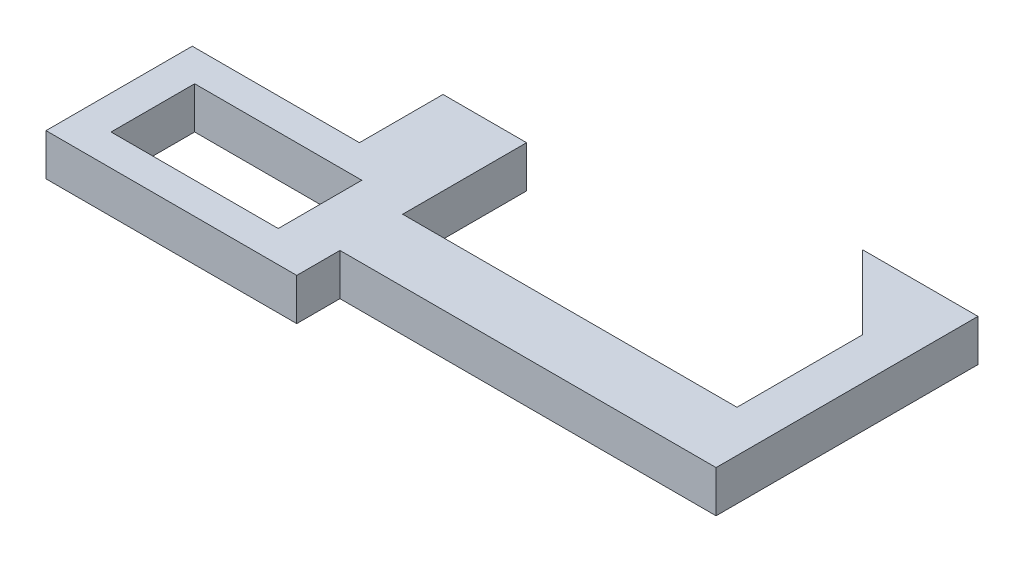
ISO-10303-21;
HEADER;
FILE_DESCRIPTION(('STEP AP214'),'2;1');
FILE_NAME('part.step','',(''),(''),'','','');
FILE_SCHEMA(('AUTOMOTIVE_DESIGN { 1 0 10303 214 1 1 1 1 }'));
ENDSEC;
DATA;
#1=APPLICATION_CONTEXT('core data for automotive mechanical design processes');
#2=APPLICATION_PROTOCOL_DEFINITION('international standard','automotive_design',2000,#1);
#3=PRODUCT_CONTEXT('',#1,'mechanical');
#4=PRODUCT('Part','Part','',(#3));
#5=PRODUCT_RELATED_PRODUCT_CATEGORY('part','',(#4));
#6=PRODUCT_DEFINITION_FORMATION('','',#4);
#7=PRODUCT_DEFINITION_CONTEXT('part definition',#1,'design');
#8=PRODUCT_DEFINITION('design','',#6,#7);
#9=PRODUCT_DEFINITION_SHAPE('','',#8);
#10=(LENGTH_UNIT() NAMED_UNIT(*) SI_UNIT(.MILLI.,.METRE.));
#11=(NAMED_UNIT(*) PLANE_ANGLE_UNIT() SI_UNIT($,.RADIAN.));
#12=(NAMED_UNIT(*) SI_UNIT($,.STERADIAN.) SOLID_ANGLE_UNIT());
#13=UNCERTAINTY_MEASURE_WITH_UNIT(LENGTH_MEASURE(1.E-05),#10,'distance_accuracy_value','');
#14=(GEOMETRIC_REPRESENTATION_CONTEXT(3) GLOBAL_UNCERTAINTY_ASSIGNED_CONTEXT((#13)) GLOBAL_UNIT_ASSIGNED_CONTEXT((#10,
#11,#12)) REPRESENTATION_CONTEXT('',''));
#15=CARTESIAN_POINT('',(0.,0.,0.));
#16=DIRECTION('',(0.,0.,1.));
#17=DIRECTION('',(1.,0.,0.));
#18=AXIS2_PLACEMENT_3D('',#15,#16,#17);
#19=CARTESIAN_POINT('',(0.,0.5,-22.7988803677588));
#20=DIRECTION('',(0.,0.,1.));
#21=DIRECTION('',(1.,0.,0.));
#22=AXIS2_PLACEMENT_3D('',#19,#20,#21);
#23=PLANE('',#22);
#24=DIRECTION('',(-1.,0.,0.));
#25=VECTOR('',#24,1.);
#26=CARTESIAN_POINT('',(0.,0.,-22.7988803677588));
#27=LINE('',#26,#25);
#28=CARTESIAN_POINT('',(-28.9731789791487,0.,-22.7988803677588));
#29=VERTEX_POINT('',#28);
#30=CARTESIAN_POINT('',(-30.9732967707679,0.,-22.7988803677588));
#31=VERTEX_POINT('',#30);
#32=EDGE_CURVE('E269',#29,#31,#27,.T.);
#33=ORIENTED_EDGE('',*,*,#32,.T.);
#34=DIRECTION('',(0.,-1.,0.));
#35=VECTOR('',#34,1.);
#36=CARTESIAN_POINT('',(-30.9732967707679,0.5,-22.7988803677588));
#37=LINE('',#36,#35);
#38=CARTESIAN_POINT('',(-30.9732967707679,0.5,-22.7988803677588));
#39=VERTEX_POINT('',#38);
#40=EDGE_CURVE('E11',#39,#31,#37,.T.);
#41=ORIENTED_EDGE('',*,*,#40,.F.);
#42=DIRECTION('',(-1.,0.,0.));
#43=VECTOR('',#42,1.);
#44=CARTESIAN_POINT('',(0.,0.5,-22.7988803677588));
#45=LINE('',#44,#43);
#46=CARTESIAN_POINT('',(-28.9731789791487,0.5,-22.7988803677588));
#47=VERTEX_POINT('',#46);
#48=EDGE_CURVE('E203',#47,#39,#45,.T.);
#49=ORIENTED_EDGE('',*,*,#48,.F.);
#50=DIRECTION('',(0.,-1.,0.));
#51=VECTOR('',#50,1.);
#52=CARTESIAN_POINT('',(-28.9731789791487,0.5,-22.7988803677588));
#53=LINE('',#52,#51);
#54=EDGE_CURVE('E221',#47,#29,#53,.T.);
#55=ORIENTED_EDGE('',*,*,#54,.T.);
#56=EDGE_LOOP('',(#33,#41,#49,#55));
#57=FACE_BOUND('',#56,.T.);
#58=ADVANCED_FACE('F39',(#57),#23,.F.);
#59=CARTESIAN_POINT('',(-30.9732967707679,0.5,0.));
#60=DIRECTION('',(-1.,0.,0.));
#61=DIRECTION('',(0.,0.,1.));
#62=AXIS2_PLACEMENT_3D('',#59,#60,#61);
#63=PLANE('',#62);
#64=DIRECTION('',(0.,0.,-1.));
#65=VECTOR('',#64,1.);
#66=CARTESIAN_POINT('',(-30.9732967707679,0.,0.));
#67=LINE('',#66,#65);
#68=CARTESIAN_POINT('',(-30.9732967707679,0.,-21.0488803677588));
#69=VERTEX_POINT('',#68);
#70=EDGE_CURVE('E272',#69,#31,#67,.T.);
#71=ORIENTED_EDGE('',*,*,#70,.F.);
#72=DIRECTION('',(0.,-1.,0.));
#73=VECTOR('',#72,1.);
#74=CARTESIAN_POINT('',(-30.9732967707679,0.5,-21.0488803677588));
#75=LINE('',#74,#73);
#76=CARTESIAN_POINT('',(-30.9732967707679,0.5,-21.0488803677588));
#77=VERTEX_POINT('',#76);
#78=EDGE_CURVE('E49',#77,#69,#75,.T.);
#79=ORIENTED_EDGE('',*,*,#78,.F.);
#80=DIRECTION('',(0.,0.,-1.));
#81=VECTOR('',#80,1.);
#82=CARTESIAN_POINT('',(-30.9732967707679,0.5,0.));
#83=LINE('',#82,#81);
#84=EDGE_CURVE('E199',#77,#39,#83,.T.);
#85=ORIENTED_EDGE('',*,*,#84,.T.);
#86=ORIENTED_EDGE('',*,*,#40,.T.);
#87=EDGE_LOOP('',(#71,#79,#85,#86));
#88=FACE_BOUND('',#87,.T.);
#89=ADVANCED_FACE('F319',(#88),#63,.T.);
#90=CARTESIAN_POINT('',(0.,0.5,-21.0488803677588));
#91=DIRECTION('',(0.,0.,1.));
#92=DIRECTION('',(1.,0.,0.));
#93=AXIS2_PLACEMENT_3D('',#90,#91,#92);
#94=PLANE('',#93);
#95=DIRECTION('',(-1.,0.,0.));
#96=VECTOR('',#95,1.);
#97=CARTESIAN_POINT('',(0.,0.,-21.0488803677588));
#98=LINE('',#97,#96);
#99=CARTESIAN_POINT('',(-27.9732967707679,0.,-21.0488803677588));
#100=VERTEX_POINT('',#99);
#101=EDGE_CURVE('E275',#100,#69,#98,.T.);
#102=ORIENTED_EDGE('',*,*,#101,.F.);
#103=DIRECTION('',(0.,-1.,0.));
#104=VECTOR('',#103,1.);
#105=CARTESIAN_POINT('',(-27.9732967707679,0.5,-21.0488803677588));
#106=LINE('',#105,#104);
#107=CARTESIAN_POINT('',(-27.9732967707679,0.5,-21.0488803677588));
#108=VERTEX_POINT('',#107);
#109=EDGE_CURVE('E237',#108,#100,#106,.T.);
#110=ORIENTED_EDGE('',*,*,#109,.F.);
#111=DIRECTION('',(-1.,0.,0.));
#112=VECTOR('',#111,1.);
#113=CARTESIAN_POINT('',(0.,0.5,-21.0488803677588));
#114=LINE('',#113,#112);
#115=EDGE_CURVE('E194',#108,#77,#114,.T.);
#116=ORIENTED_EDGE('',*,*,#115,.T.);
#117=ORIENTED_EDGE('',*,*,#78,.T.);
#118=EDGE_LOOP('',(#102,#110,#116,#117));
#119=FACE_BOUND('',#118,.T.);
#120=ADVANCED_FACE('F324',(#119),#94,.T.);
#121=CARTESIAN_POINT('',(-27.9732967707679,0.5,0.));
#122=DIRECTION('',(1.,0.,0.));
#123=DIRECTION('',(0.,0.,-1.));
#124=AXIS2_PLACEMENT_3D('',#121,#122,#123);
#125=PLANE('',#124);
#126=DIRECTION('',(0.,0.,1.));
#127=VECTOR('',#126,1.);
#128=CARTESIAN_POINT('',(-27.9732967707679,0.,0.));
#129=LINE('',#128,#127);
#130=CARTESIAN_POINT('',(-27.9732967707679,0.,-21.5659490466984));
#131=VERTEX_POINT('',#130);
#132=EDGE_CURVE('E278',#131,#100,#129,.T.);
#133=ORIENTED_EDGE('',*,*,#132,.F.);
#134=DIRECTION('',(0.,-1.,0.));
#135=VECTOR('',#134,1.);
#136=CARTESIAN_POINT('',(-27.9732967707679,0.5,-21.5659490466984));
#137=LINE('',#136,#135);
#138=CARTESIAN_POINT('',(-27.9732967707679,0.5,-21.5659490466984));
#139=VERTEX_POINT('',#138);
#140=EDGE_CURVE('E235',#139,#131,#137,.T.);
#141=ORIENTED_EDGE('',*,*,#140,.F.);
#142=DIRECTION('',(0.,0.,1.));
#143=VECTOR('',#142,1.);
#144=CARTESIAN_POINT('',(-27.9732967707679,0.5,0.));
#145=LINE('',#144,#143);
#146=EDGE_CURVE('E187',#139,#108,#145,.T.);
#147=ORIENTED_EDGE('',*,*,#146,.T.);
#148=ORIENTED_EDGE('',*,*,#109,.T.);
#149=EDGE_LOOP('',(#133,#141,#147,#148));
#150=FACE_BOUND('',#149,.T.);
#151=ADVANCED_FACE('F342',(#150),#125,.T.);
#152=CARTESIAN_POINT('',(0.,0.5,-21.5659490466984));
#153=DIRECTION('',(0.,0.,-1.));
#154=DIRECTION('',(-1.,0.,0.));
#155=AXIS2_PLACEMENT_3D('',#152,#153,#154);
#156=PLANE('',#155);
#157=DIRECTION('',(1.,0.,0.));
#158=VECTOR('',#157,1.);
#159=CARTESIAN_POINT('',(0.,0.,-21.5659490466984));
#160=LINE('',#159,#158);
#161=CARTESIAN_POINT('',(-23.4732967707679,0.,-21.5659490466984));
#162=VERTEX_POINT('',#161);
#163=EDGE_CURVE('E281',#131,#162,#160,.T.);
#164=ORIENTED_EDGE('',*,*,#163,.T.);
#165=DIRECTION('',(0.,-1.,0.));
#166=VECTOR('',#165,1.);
#167=CARTESIAN_POINT('',(-23.4732967707679,0.5,-21.5659490466984));
#168=LINE('',#167,#166);
#169=CARTESIAN_POINT('',(-23.4732967707679,0.5,-21.5659490466984));
#170=VERTEX_POINT('',#169);
#171=EDGE_CURVE('E233',#170,#162,#168,.T.);
#172=ORIENTED_EDGE('',*,*,#171,.F.);
#173=DIRECTION('',(1.,0.,0.));
#174=VECTOR('',#173,1.);
#175=CARTESIAN_POINT('',(0.,0.5,-21.5659490466984));
#176=LINE('',#175,#174);
#177=EDGE_CURVE('E193',#139,#170,#176,.T.);
#178=ORIENTED_EDGE('',*,*,#177,.F.);
#179=ORIENTED_EDGE('',*,*,#140,.T.);
#180=EDGE_LOOP('',(#164,#172,#178,#179));
#181=FACE_BOUND('',#180,.T.);
#182=ADVANCED_FACE('F362',(#181),#156,.F.);
#183=CARTESIAN_POINT('',(-23.4732967707679,0.5,0.));
#184=DIRECTION('',(1.,0.,0.));
#185=DIRECTION('',(0.,0.,-1.));
#186=AXIS2_PLACEMENT_3D('',#183,#184,#185);
#187=PLANE('',#186);
#188=DIRECTION('',(0.,0.,1.));
#189=VECTOR('',#188,1.);
#190=CARTESIAN_POINT('',(-23.4732967707679,0.,0.));
#191=LINE('',#190,#189);
#192=CARTESIAN_POINT('',(-23.4732967707679,0.,-24.6998325231816));
#193=VERTEX_POINT('',#192);
#194=EDGE_CURVE('E284',#193,#162,#191,.T.);
#195=ORIENTED_EDGE('',*,*,#194,.F.);
#196=DIRECTION('',(0.,-1.,0.));
#197=VECTOR('',#196,1.);
#198=CARTESIAN_POINT('',(-23.4732967707679,0.5,-24.6998325231816));
#199=LINE('',#198,#197);
#200=CARTESIAN_POINT('',(-23.4732967707679,0.5,-24.6998325231816));
#201=VERTEX_POINT('',#200);
#202=EDGE_CURVE('E231',#201,#193,#199,.T.);
#203=ORIENTED_EDGE('',*,*,#202,.F.);
#204=DIRECTION('',(0.,0.,1.));
#205=VECTOR('',#204,1.);
#206=CARTESIAN_POINT('',(-23.4732967707679,0.5,0.));
#207=LINE('',#206,#205);
#208=EDGE_CURVE('E197',#201,#170,#207,.T.);
#209=ORIENTED_EDGE('',*,*,#208,.T.);
#210=ORIENTED_EDGE('',*,*,#171,.T.);
#211=EDGE_LOOP('',(#195,#203,#209,#210));
#212=FACE_BOUND('',#211,.T.);
#213=ADVANCED_FACE('F358',(#212),#187,.T.);
#214=CARTESIAN_POINT('',(0.,0.5,-24.6998325231816));
#215=DIRECTION('',(0.,0.,-1.));
#216=DIRECTION('',(-1.,0.,0.));
#217=AXIS2_PLACEMENT_3D('',#214,#215,#216);
#218=PLANE('',#217);
#219=DIRECTION('',(1.,0.,0.));
#220=VECTOR('',#219,1.);
#221=CARTESIAN_POINT('',(0.,0.,-24.6998325231816));
#222=LINE('',#221,#220);
#223=CARTESIAN_POINT('',(-24.8571802472511,0.,-24.6998325231816));
#224=VERTEX_POINT('',#223);
#225=EDGE_CURVE('E287',#224,#193,#222,.T.);
#226=ORIENTED_EDGE('',*,*,#225,.F.);
#227=DIRECTION('',(0.,-1.,0.));
#228=VECTOR('',#227,1.);
#229=CARTESIAN_POINT('',(-24.8571802472511,0.5,-24.6998325231816));
#230=LINE('',#229,#228);
#231=CARTESIAN_POINT('',(-24.8571802472511,0.5,-24.6998325231816));
#232=VERTEX_POINT('',#231);
#233=EDGE_CURVE('E229',#232,#224,#230,.T.);
#234=ORIENTED_EDGE('',*,*,#233,.F.);
#235=DIRECTION('',(1.,0.,0.));
#236=VECTOR('',#235,1.);
#237=CARTESIAN_POINT('',(0.,0.5,-24.6998325231816));
#238=LINE('',#237,#236);
#239=EDGE_CURVE('E381',#232,#201,#238,.T.);
#240=ORIENTED_EDGE('',*,*,#239,.T.);
#241=ORIENTED_EDGE('',*,*,#202,.T.);
#242=EDGE_LOOP('',(#226,#234,#240,#241));
#243=FACE_BOUND('',#242,.T.);
#244=ADVANCED_FACE('F354',(#243),#218,.T.);
#245=CARTESIAN_POINT('',(-0.0786738620347423,0.5,0.0786738620347423));
#246=DIRECTION('',(-0.707106781186547,0.,0.707106781186547));
#247=DIRECTION('',(0.707106781186548,0.,0.707106781186548));
#248=AXIS2_PLACEMENT_3D('',#245,#246,#247);
#249=PLANE('',#248);
#250=DIRECTION('',(-0.707106781186548,0.,-0.707106781186548));
#251=VECTOR('',#250,1.);
#252=CARTESIAN_POINT('',(-0.0786738620347423,0.,0.0786738620347423));
#253=LINE('',#252,#251);
#254=CARTESIAN_POINT('',(-23.9732967707679,0.,-23.8159490466984));
#255=VERTEX_POINT('',#254);
#256=EDGE_CURVE('E290',#255,#224,#253,.T.);
#257=ORIENTED_EDGE('',*,*,#256,.F.);
#258=DIRECTION('',(0.,-1.,0.));
#259=VECTOR('',#258,1.);
#260=CARTESIAN_POINT('',(-23.9732967707679,0.5,-23.8159490466984));
#261=LINE('',#260,#259);
#262=CARTESIAN_POINT('',(-23.9732967707679,0.5,-23.8159490466984));
#263=VERTEX_POINT('',#262);
#264=EDGE_CURVE('E227',#263,#255,#261,.T.);
#265=ORIENTED_EDGE('',*,*,#264,.F.);
#266=DIRECTION('',(-0.707106781186548,0.,-0.707106781186548));
#267=VECTOR('',#266,1.);
#268=CARTESIAN_POINT('',(-0.0786738620347423,0.5,0.0786738620347423));
#269=LINE('',#268,#267);
#270=EDGE_CURVE('E386',#263,#232,#269,.T.);
#271=ORIENTED_EDGE('',*,*,#270,.T.);
#272=ORIENTED_EDGE('',*,*,#233,.T.);
#273=EDGE_LOOP('',(#257,#265,#271,#272));
#274=FACE_BOUND('',#273,.T.);
#275=ADVANCED_FACE('F350',(#274),#249,.T.);
#276=CARTESIAN_POINT('',(-23.9732967707679,0.5,0.));
#277=DIRECTION('',(-1.,0.,0.));
#278=DIRECTION('',(0.,0.,1.));
#279=AXIS2_PLACEMENT_3D('',#276,#277,#278);
#280=PLANE('',#279);
#281=DIRECTION('',(0.,0.,-1.));
#282=VECTOR('',#281,1.);
#283=CARTESIAN_POINT('',(-23.9732967707679,0.,0.));
#284=LINE('',#283,#282);
#285=CARTESIAN_POINT('',(-23.9732967707679,0.,-22.3159490466984));
#286=VERTEX_POINT('',#285);
#287=EDGE_CURVE('E293',#286,#255,#284,.T.);
#288=ORIENTED_EDGE('',*,*,#287,.F.);
#289=DIRECTION('',(0.,-1.,0.));
#290=VECTOR('',#289,1.);
#291=CARTESIAN_POINT('',(-23.9732967707679,0.5,-22.3159490466984));
#292=LINE('',#291,#290);
#293=CARTESIAN_POINT('',(-23.9732967707679,0.5,-22.3159490466984));
#294=VERTEX_POINT('',#293);
#295=EDGE_CURVE('E225',#294,#286,#292,.T.);
#296=ORIENTED_EDGE('',*,*,#295,.F.);
#297=DIRECTION('',(0.,0.,-1.));
#298=VECTOR('',#297,1.);
#299=CARTESIAN_POINT('',(-23.9732967707679,0.5,0.));
#300=LINE('',#299,#298);
#301=EDGE_CURVE('E188',#294,#263,#300,.T.);
#302=ORIENTED_EDGE('',*,*,#301,.T.);
#303=ORIENTED_EDGE('',*,*,#264,.T.);
#304=EDGE_LOOP('',(#288,#296,#302,#303));
#305=FACE_BOUND('',#304,.T.);
#306=ADVANCED_FACE('F346',(#305),#280,.T.);
#307=CARTESIAN_POINT('',(0.,0.5,-22.3159490466984));
#308=DIRECTION('',(0.,0.,-1.));
#309=DIRECTION('',(-1.,0.,0.));
#310=AXIS2_PLACEMENT_3D('',#307,#308,#309);
#311=PLANE('',#310);
#312=DIRECTION('',(1.,0.,0.));
#313=VECTOR('',#312,1.);
#314=CARTESIAN_POINT('',(0.,0.,-22.3159490466984));
#315=LINE('',#314,#313);
#316=CARTESIAN_POINT('',(-27.9732967707679,0.,-22.3159490466984));
#317=VERTEX_POINT('',#316);
#318=EDGE_CURVE('E295',#317,#286,#315,.T.);
#319=ORIENTED_EDGE('',*,*,#318,.F.);
#320=DIRECTION('',(0.,-1.,0.));
#321=VECTOR('',#320,1.);
#322=CARTESIAN_POINT('',(-27.9732967707679,0.5,-22.3159490466984));
#323=LINE('',#322,#321);
#324=CARTESIAN_POINT('',(-27.9732967707679,0.5,-22.3159490466984));
#325=VERTEX_POINT('',#324);
#326=EDGE_CURVE('E175',#325,#317,#323,.T.);
#327=ORIENTED_EDGE('',*,*,#326,.F.);
#328=DIRECTION('',(1.,0.,0.));
#329=VECTOR('',#328,1.);
#330=CARTESIAN_POINT('',(0.,0.5,-22.3159490466984));
#331=LINE('',#330,#329);
#332=EDGE_CURVE('E185',#325,#294,#331,.T.);
#333=ORIENTED_EDGE('',*,*,#332,.T.);
#334=ORIENTED_EDGE('',*,*,#295,.T.);
#335=EDGE_LOOP('',(#319,#327,#333,#334));
#336=FACE_BOUND('',#335,.T.);
#337=ADVANCED_FACE('F340',(#336),#311,.T.);
#338=CARTESIAN_POINT('',(-27.9732967707679,0.,-23.7988803677588));
#339=VERTEX_POINT('',#338);
#340=EDGE_CURVE('E174',#339,#317,#129,.T.);
#341=ORIENTED_EDGE('',*,*,#340,.F.);
#342=DIRECTION('',(0.,-1.,0.));
#343=VECTOR('',#342,1.);
#344=CARTESIAN_POINT('',(-27.9732967707679,0.5,-23.7988803677588));
#345=LINE('',#344,#343);
#346=CARTESIAN_POINT('',(-27.9732967707679,0.5,-23.7988803677588));
#347=VERTEX_POINT('',#346);
#348=EDGE_CURVE('E168',#347,#339,#345,.T.);
#349=ORIENTED_EDGE('',*,*,#348,.F.);
#350=EDGE_CURVE('E172',#347,#325,#145,.T.);
#351=ORIENTED_EDGE('',*,*,#350,.T.);
#352=ORIENTED_EDGE('',*,*,#326,.T.);
#353=EDGE_LOOP('',(#341,#349,#351,#352));
#354=FACE_BOUND('',#353,.T.);
#355=ADVANCED_FACE('F170',(#354),#125,.T.);
#356=CARTESIAN_POINT('',(0.,0.5,-23.7988803677588));
#357=DIRECTION('',(0.,0.,1.));
#358=DIRECTION('',(1.,0.,0.));
#359=AXIS2_PLACEMENT_3D('',#356,#357,#358);
#360=PLANE('',#359);
#361=DIRECTION('',(-1.,0.,0.));
#362=VECTOR('',#361,1.);
#363=CARTESIAN_POINT('',(0.,0.,-23.7988803677588));
#364=LINE('',#363,#362);
#365=CARTESIAN_POINT('',(-28.9731789791487,0.,-23.7988803677588));
#366=VERTEX_POINT('',#365);
#367=EDGE_CURVE('E112',#339,#366,#364,.T.);
#368=ORIENTED_EDGE('',*,*,#367,.T.);
#369=DIRECTION('',(0.,-1.,0.));
#370=VECTOR('',#369,1.);
#371=CARTESIAN_POINT('',(-28.9731789791487,0.5,-23.7988803677588));
#372=LINE('',#371,#370);
#373=CARTESIAN_POINT('',(-28.9731789791487,0.5,-23.7988803677588));
#374=VERTEX_POINT('',#373);
#375=EDGE_CURVE('E176',#374,#366,#372,.T.);
#376=ORIENTED_EDGE('',*,*,#375,.F.);
#377=DIRECTION('',(-1.,0.,0.));
#378=VECTOR('',#377,1.);
#379=CARTESIAN_POINT('',(0.,0.5,-23.7988803677588));
#380=LINE('',#379,#378);
#381=EDGE_CURVE('E178',#347,#374,#380,.T.);
#382=ORIENTED_EDGE('',*,*,#381,.F.);
#383=ORIENTED_EDGE('',*,*,#348,.T.);
#384=EDGE_LOOP('',(#368,#376,#382,#383));
#385=FACE_BOUND('',#384,.T.);
#386=ADVANCED_FACE('F179',(#385),#360,.F.);
#387=CARTESIAN_POINT('',(-30.5697492979419,0.5,0.));
#388=DIRECTION('',(1.,0.,0.));
#389=DIRECTION('',(0.,0.,-1.));
#390=AXIS2_PLACEMENT_3D('',#387,#388,#389);
#391=PLANE('',#390);
#392=DIRECTION('',(0.,0.,1.));
#393=VECTOR('',#392,1.);
#394=CARTESIAN_POINT('',(-30.5697492979419,0.,0.));
#395=LINE('',#394,#393);
#396=CARTESIAN_POINT('',(-30.5697492979419,0.,-22.4238803677588));
#397=VERTEX_POINT('',#396);
#398=CARTESIAN_POINT('',(-30.5697492979419,0.,-21.4238803677588));
#399=VERTEX_POINT('',#398);
#400=EDGE_CURVE('E259',#397,#399,#395,.T.);
#401=ORIENTED_EDGE('',*,*,#400,.F.);
#402=DIRECTION('',(0.,-1.,0.));
#403=VECTOR('',#402,1.);
#404=CARTESIAN_POINT('',(-30.5697492979419,0.5,-22.4238803677588));
#405=LINE('',#404,#403);
#406=CARTESIAN_POINT('',(-30.5697492979419,0.5,-22.4238803677588));
#407=VERTEX_POINT('',#406);
#408=EDGE_CURVE('E43',#407,#397,#405,.T.);
#409=ORIENTED_EDGE('',*,*,#408,.F.);
#410=DIRECTION('',(0.,0.,1.));
#411=VECTOR('',#410,1.);
#412=CARTESIAN_POINT('',(-30.5697492979419,0.5,0.));
#413=LINE('',#412,#411);
#414=CARTESIAN_POINT('',(-30.5697492979419,0.5,-21.4238803677588));
#415=VERTEX_POINT('',#414);
#416=EDGE_CURVE('E214',#407,#415,#413,.T.);
#417=ORIENTED_EDGE('',*,*,#416,.T.);
#418=DIRECTION('',(0.,-1.,0.));
#419=VECTOR('',#418,1.);
#420=CARTESIAN_POINT('',(-30.5697492979419,0.5,-21.4238803677588));
#421=LINE('',#420,#419);
#422=EDGE_CURVE('E240',#415,#399,#421,.T.);
#423=ORIENTED_EDGE('',*,*,#422,.T.);
#424=EDGE_LOOP('',(#401,#409,#417,#423));
#425=FACE_BOUND('',#424,.T.);
#426=ADVANCED_FACE('F41',(#425),#391,.T.);
#427=CARTESIAN_POINT('',(0.,0.5,-22.4238803677588));
#428=DIRECTION('',(0.,0.,-1.));
#429=DIRECTION('',(-1.,0.,0.));
#430=AXIS2_PLACEMENT_3D('',#427,#428,#429);
#431=PLANE('',#430);
#432=DIRECTION('',(1.,0.,0.));
#433=VECTOR('',#432,1.);
#434=CARTESIAN_POINT('',(0.,0.,-22.4238803677588));
#435=LINE('',#434,#433);
#436=CARTESIAN_POINT('',(-28.5697492979419,0.,-22.4238803677588));
#437=VERTEX_POINT('',#436);
#438=EDGE_CURVE('E253',#397,#437,#435,.T.);
#439=ORIENTED_EDGE('',*,*,#438,.T.);
#440=DIRECTION('',(0.,-1.,0.));
#441=VECTOR('',#440,1.);
#442=CARTESIAN_POINT('',(-28.5697492979419,0.5,-22.4238803677588));
#443=LINE('',#442,#441);
#444=CARTESIAN_POINT('',(-28.5697492979419,0.5,-22.4238803677588));
#445=VERTEX_POINT('',#444);
#446=EDGE_CURVE('E243',#445,#437,#443,.T.);
#447=ORIENTED_EDGE('',*,*,#446,.F.);
#448=DIRECTION('',(1.,0.,0.));
#449=VECTOR('',#448,1.);
#450=CARTESIAN_POINT('',(0.,0.5,-22.4238803677588));
#451=LINE('',#450,#449);
#452=EDGE_CURVE('E212',#407,#445,#451,.T.);
#453=ORIENTED_EDGE('',*,*,#452,.F.);
#454=ORIENTED_EDGE('',*,*,#408,.T.);
#455=EDGE_LOOP('',(#439,#447,#453,#454));
#456=FACE_BOUND('',#455,.T.);
#457=ADVANCED_FACE('F252',(#456),#431,.F.);
#458=CARTESIAN_POINT('',(-28.5697492979419,0.5,0.));
#459=DIRECTION('',(1.,0.,0.));
#460=DIRECTION('',(0.,0.,-1.));
#461=AXIS2_PLACEMENT_3D('',#458,#459,#460);
#462=PLANE('',#461);
#463=DIRECTION('',(0.,0.,1.));
#464=VECTOR('',#463,1.);
#465=CARTESIAN_POINT('',(-28.5697492979419,0.,0.));
#466=LINE('',#465,#464);
#467=CARTESIAN_POINT('',(-28.5697492979419,0.,-21.4238803677588));
#468=VERTEX_POINT('',#467);
#469=EDGE_CURVE('E261',#437,#468,#466,.T.);
#470=ORIENTED_EDGE('',*,*,#469,.T.);
#471=DIRECTION('',(0.,-1.,0.));
#472=VECTOR('',#471,1.);
#473=CARTESIAN_POINT('',(-28.5697492979419,0.5,-21.4238803677588));
#474=LINE('',#473,#472);
#475=CARTESIAN_POINT('',(-28.5697492979419,0.5,-21.4238803677588));
#476=VERTEX_POINT('',#475);
#477=EDGE_CURVE('E242',#476,#468,#474,.T.);
#478=ORIENTED_EDGE('',*,*,#477,.F.);
#479=DIRECTION('',(0.,0.,1.));
#480=VECTOR('',#479,1.);
#481=CARTESIAN_POINT('',(-28.5697492979419,0.5,0.));
#482=LINE('',#481,#480);
#483=EDGE_CURVE('E210',#445,#476,#482,.T.);
#484=ORIENTED_EDGE('',*,*,#483,.F.);
#485=ORIENTED_EDGE('',*,*,#446,.T.);
#486=EDGE_LOOP('',(#470,#478,#484,#485));
#487=FACE_BOUND('',#486,.T.);
#488=ADVANCED_FACE('F313',(#487),#462,.F.);
#489=CARTESIAN_POINT('',(0.,0.5,-21.4238803677588));
#490=DIRECTION('',(0.,0.,-1.));
#491=DIRECTION('',(-1.,0.,0.));
#492=AXIS2_PLACEMENT_3D('',#489,#490,#491);
#493=PLANE('',#492);
#494=DIRECTION('',(1.,0.,0.));
#495=VECTOR('',#494,1.);
#496=CARTESIAN_POINT('',(0.,0.,-21.4238803677588));
#497=LINE('',#496,#495);
#498=EDGE_CURVE('E267',#399,#468,#497,.T.);
#499=ORIENTED_EDGE('',*,*,#498,.F.);
#500=ORIENTED_EDGE('',*,*,#422,.F.);
#501=DIRECTION('',(1.,0.,0.));
#502=VECTOR('',#501,1.);
#503=CARTESIAN_POINT('',(0.,0.5,-21.4238803677588));
#504=LINE('',#503,#502);
#505=EDGE_CURVE('E207',#415,#476,#504,.T.);
#506=ORIENTED_EDGE('',*,*,#505,.T.);
#507=ORIENTED_EDGE('',*,*,#477,.T.);
#508=EDGE_LOOP('',(#499,#500,#506,#507));
#509=FACE_BOUND('',#508,.T.);
#510=ADVANCED_FACE('F305',(#509),#493,.T.);
#511=CARTESIAN_POINT('',(-28.9731789791487,0.5,0.));
#512=DIRECTION('',(1.,0.,0.));
#513=DIRECTION('',(0.,0.,-1.));
#514=AXIS2_PLACEMENT_3D('',#511,#512,#513);
#515=PLANE('',#514);
#516=DIRECTION('',(0.,0.,1.));
#517=VECTOR('',#516,1.);
#518=CARTESIAN_POINT('',(-28.9731789791487,0.,0.));
#519=LINE('',#518,#517);
#520=EDGE_CURVE('E118',#366,#29,#519,.T.);
#521=ORIENTED_EDGE('',*,*,#520,.T.);
#522=ORIENTED_EDGE('',*,*,#54,.F.);
#523=DIRECTION('',(0.,0.,1.));
#524=VECTOR('',#523,1.);
#525=CARTESIAN_POINT('',(-28.9731789791487,0.5,0.));
#526=LINE('',#525,#524);
#527=EDGE_CURVE('E58',#374,#47,#526,.T.);
#528=ORIENTED_EDGE('',*,*,#527,.F.);
#529=ORIENTED_EDGE('',*,*,#375,.T.);
#530=EDGE_LOOP('',(#521,#522,#528,#529));
#531=FACE_BOUND('',#530,.T.);
#532=ADVANCED_FACE('F303',(#531),#515,.F.);
#533=CARTESIAN_POINT('',(0.,0.5,0.));
#534=DIRECTION('',(0.,1.,0.));
#535=DIRECTION('',(0.,0.,1.));
#536=AXIS2_PLACEMENT_3D('',#533,#534,#535);
#537=PLANE('',#536);
#538=ORIENTED_EDGE('',*,*,#416,.F.);
#539=ORIENTED_EDGE('',*,*,#452,.T.);
#540=ORIENTED_EDGE('',*,*,#483,.T.);
#541=ORIENTED_EDGE('',*,*,#505,.F.);
#542=EDGE_LOOP('',(#538,#539,#540,#541));
#543=FACE_BOUND('',#542,.T.);
#544=ORIENTED_EDGE('',*,*,#48,.T.);
#545=ORIENTED_EDGE('',*,*,#84,.F.);
#546=ORIENTED_EDGE('',*,*,#115,.F.);
#547=ORIENTED_EDGE('',*,*,#146,.F.);
#548=ORIENTED_EDGE('',*,*,#177,.T.);
#549=ORIENTED_EDGE('',*,*,#208,.F.);
#550=ORIENTED_EDGE('',*,*,#239,.F.);
#551=ORIENTED_EDGE('',*,*,#270,.F.);
#552=ORIENTED_EDGE('',*,*,#301,.F.);
#553=ORIENTED_EDGE('',*,*,#332,.F.);
#554=ORIENTED_EDGE('',*,*,#350,.F.);
#555=ORIENTED_EDGE('',*,*,#381,.T.);
#556=ORIENTED_EDGE('',*,*,#527,.T.);
#557=EDGE_LOOP('',(#544,#545,#546,#547,#548,#549,#550,#551,#552,#553,#554,#555,#556));
#558=FACE_BOUND('',#557,.T.);
#559=ADVANCED_FACE('F182',(#543,#558),#537,.T.);
#560=CARTESIAN_POINT('',(0.,0.,0.));
#561=DIRECTION('',(0.,1.,0.));
#562=DIRECTION('',(0.,0.,1.));
#563=AXIS2_PLACEMENT_3D('',#560,#561,#562);
#564=PLANE('',#563);
#565=ORIENTED_EDGE('',*,*,#400,.T.);
#566=ORIENTED_EDGE('',*,*,#498,.T.);
#567=ORIENTED_EDGE('',*,*,#469,.F.);
#568=ORIENTED_EDGE('',*,*,#438,.F.);
#569=EDGE_LOOP('',(#565,#566,#567,#568));
#570=FACE_BOUND('',#569,.T.);
#571=ORIENTED_EDGE('',*,*,#32,.F.);
#572=ORIENTED_EDGE('',*,*,#520,.F.);
#573=ORIENTED_EDGE('',*,*,#367,.F.);
#574=ORIENTED_EDGE('',*,*,#340,.T.);
#575=ORIENTED_EDGE('',*,*,#318,.T.);
#576=ORIENTED_EDGE('',*,*,#287,.T.);
#577=ORIENTED_EDGE('',*,*,#256,.T.);
#578=ORIENTED_EDGE('',*,*,#225,.T.);
#579=ORIENTED_EDGE('',*,*,#194,.T.);
#580=ORIENTED_EDGE('',*,*,#163,.F.);
#581=ORIENTED_EDGE('',*,*,#132,.T.);
#582=ORIENTED_EDGE('',*,*,#101,.T.);
#583=ORIENTED_EDGE('',*,*,#70,.T.);
#584=EDGE_LOOP('',(#571,#572,#573,#574,#575,#576,#577,#578,#579,#580,#581,#582,#583));
#585=FACE_BOUND('',#584,.T.);
#586=ADVANCED_FACE('F256',(#570,#585),#564,.F.);
#587=CLOSED_SHELL('',(#58,#89,#120,#151,#182,#213,#244,#275,#306,#337,#355,#386,#426,#457,#488,
#510,#532,#559,#586));
#588=MANIFOLD_SOLID_BREP('B2',#587);
#589=ADVANCED_BREP_SHAPE_REPRESENTATION('',(#18,#588),#14);
#590=SHAPE_DEFINITION_REPRESENTATION(#9,#589);
ENDSEC;
END-ISO-10303-21;
